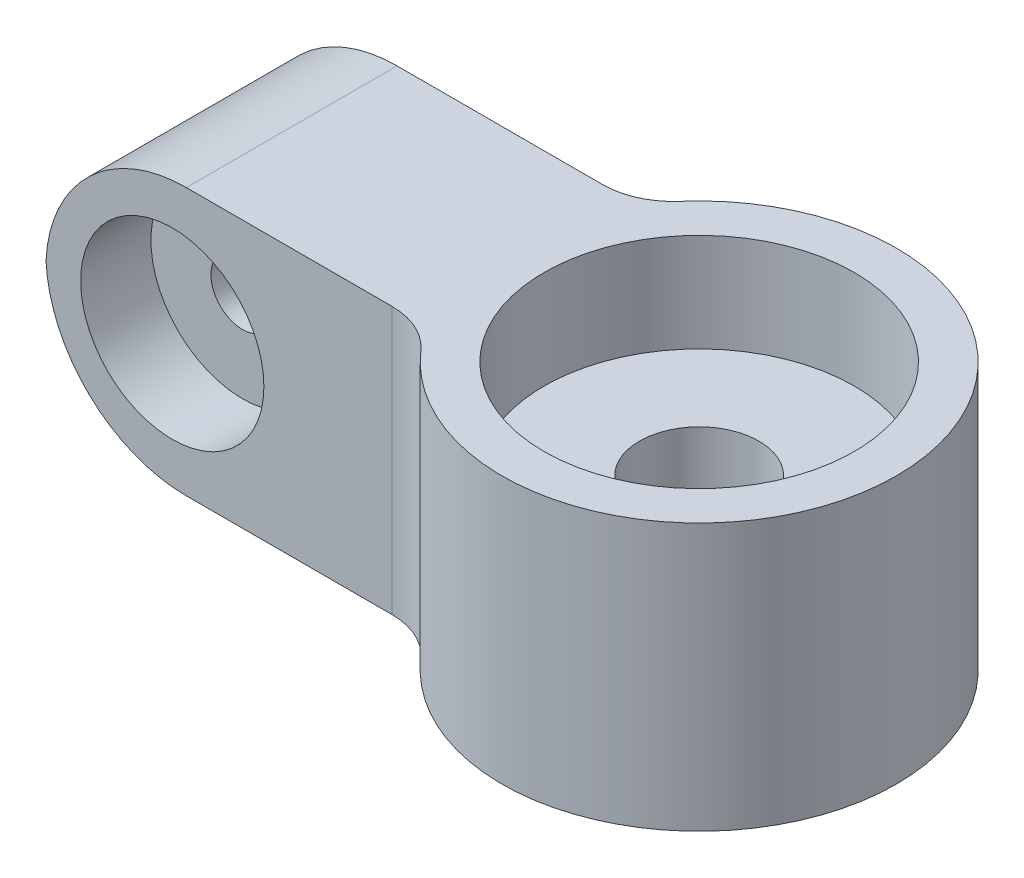
ISO-10303-21;
HEADER;
FILE_DESCRIPTION(('STEP AP214'),'2;1');
FILE_NAME('part.step','',(''),(''),'','','');
FILE_SCHEMA(('AUTOMOTIVE_DESIGN { 1 0 10303 214 1 1 1 1 }'));
ENDSEC;
DATA;
#1=APPLICATION_CONTEXT('core data for automotive mechanical design processes');
#2=APPLICATION_PROTOCOL_DEFINITION('international standard','automotive_design',2000,#1);
#3=PRODUCT_CONTEXT('',#1,'mechanical');
#4=PRODUCT('Part','Part','',(#3));
#5=PRODUCT_RELATED_PRODUCT_CATEGORY('part','',(#4));
#6=PRODUCT_DEFINITION_FORMATION('','',#4);
#7=PRODUCT_DEFINITION_CONTEXT('part definition',#1,'design');
#8=PRODUCT_DEFINITION('design','',#6,#7);
#9=PRODUCT_DEFINITION_SHAPE('','',#8);
#10=(LENGTH_UNIT() NAMED_UNIT(*) SI_UNIT(.MILLI.,.METRE.));
#11=(NAMED_UNIT(*) PLANE_ANGLE_UNIT() SI_UNIT($,.RADIAN.));
#12=(NAMED_UNIT(*) SI_UNIT($,.STERADIAN.) SOLID_ANGLE_UNIT());
#13=UNCERTAINTY_MEASURE_WITH_UNIT(LENGTH_MEASURE(1.E-05),#10,'distance_accuracy_value','');
#14=(GEOMETRIC_REPRESENTATION_CONTEXT(3) GLOBAL_UNCERTAINTY_ASSIGNED_CONTEXT((#13)) GLOBAL_UNIT_ASSIGNED_CONTEXT((#10,
#11,#12)) REPRESENTATION_CONTEXT('',''));
#15=CARTESIAN_POINT('',(0.,0.,0.));
#16=DIRECTION('',(0.,0.,1.));
#17=DIRECTION('',(1.,0.,0.));
#18=AXIS2_PLACEMENT_3D('',#15,#16,#17);
#19=CARTESIAN_POINT('',(39.,-9.5,0.));
#20=DIRECTION('',(0.,1.,0.));
#21=DIRECTION('',(0.,0.,1.));
#22=AXIS2_PLACEMENT_3D('',#19,#20,#21);
#23=CYLINDRICAL_SURFACE('',#22,4.25000000000001);
#24=CARTESIAN_POINT('',(39.,2.5,0.));
#25=DIRECTION('',(0.,1.,0.));
#26=DIRECTION('',(0.,0.,1.));
#27=AXIS2_PLACEMENT_3D('',#24,#25,#26);
#28=CIRCLE('',#27,4.25000000000001);
#29=CARTESIAN_POINT('',(39.,2.5,4.25000000000001));
#30=VERTEX_POINT('',#29);
#31=EDGE_CURVE('E136',#30,#30,#28,.F.);
#32=ORIENTED_EDGE('',*,*,#31,.F.);
#33=EDGE_LOOP('',(#32));
#34=FACE_BOUND('',#33,.T.);
#35=CARTESIAN_POINT('',(39.,-2.5,0.));
#36=DIRECTION('',(0.,1.,0.));
#37=DIRECTION('',(0.,0.,1.));
#38=AXIS2_PLACEMENT_3D('',#35,#36,#37);
#39=CIRCLE('',#38,4.25000000000001);
#40=CARTESIAN_POINT('',(39.,-2.5,4.25000000000001));
#41=VERTEX_POINT('',#40);
#42=EDGE_CURVE('E224',#41,#41,#39,.F.);
#43=ORIENTED_EDGE('',*,*,#42,.T.);
#44=EDGE_LOOP('',(#43));
#45=FACE_BOUND('',#44,.T.);
#46=ADVANCED_FACE('F41',(#34,#45),#23,.F.);
#47=CARTESIAN_POINT('',(9.,0.,7.5));
#48=DIRECTION('',(0.,0.,-1.));
#49=DIRECTION('',(-1.,0.,0.));
#50=AXIS2_PLACEMENT_3D('',#47,#48,#49);
#51=CYLINDRICAL_SURFACE('',#50,2.25);
#52=CARTESIAN_POINT('',(9.,0.,-2.5));
#53=DIRECTION('',(0.,0.,1.));
#54=DIRECTION('',(1.,0.,0.));
#55=AXIS2_PLACEMENT_3D('',#52,#53,#54);
#56=CIRCLE('',#55,2.25);
#57=CARTESIAN_POINT('',(11.25,0.,-2.5));
#58=VERTEX_POINT('',#57);
#59=EDGE_CURVE('E209',#58,#58,#56,.T.);
#60=ORIENTED_EDGE('',*,*,#59,.F.);
#61=EDGE_LOOP('',(#60));
#62=FACE_BOUND('',#61,.T.);
#63=CARTESIAN_POINT('',(9.,0.,2.5));
#64=DIRECTION('',(0.,0.,1.));
#65=DIRECTION('',(1.,0.,0.));
#66=AXIS2_PLACEMENT_3D('',#63,#64,#65);
#67=CIRCLE('',#66,2.25);
#68=CARTESIAN_POINT('',(11.25,0.,2.5));
#69=VERTEX_POINT('',#68);
#70=EDGE_CURVE('E217',#69,#69,#67,.T.);
#71=ORIENTED_EDGE('',*,*,#70,.T.);
#72=EDGE_LOOP('',(#71));
#73=FACE_BOUND('',#72,.T.);
#74=ADVANCED_FACE('F246',(#62,#73),#51,.F.);
#75=CARTESIAN_POINT('',(0.,-9.5,7.5));
#76=DIRECTION('',(0.,1.,0.));
#77=DIRECTION('',(0.,0.,1.));
#78=AXIS2_PLACEMENT_3D('',#75,#76,#77);
#79=PLANE('',#78);
#80=CARTESIAN_POINT('',(39.,-9.5,0.));
#81=DIRECTION('',(0.,1.,0.));
#82=DIRECTION('',(0.,0.,1.));
#83=AXIS2_PLACEMENT_3D('',#80,#81,#82);
#84=CIRCLE('',#83,11.04);
#85=CARTESIAN_POINT('',(39.,-9.5,11.04));
#86=VERTEX_POINT('',#85);
#87=EDGE_CURVE('E193',#86,#86,#84,.T.);
#88=ORIENTED_EDGE('',*,*,#87,.T.);
#89=EDGE_LOOP('',(#88));
#90=FACE_BOUND('',#89,.T.);
#91=DIRECTION('',(1.,0.,0.));
#92=VECTOR('',#91,1.);
#93=CARTESIAN_POINT('',(0.,-9.5,7.5));
#94=LINE('',#93,#92);
#95=CARTESIAN_POINT('',(10.,-9.5,7.5));
#96=VERTEX_POINT('',#95);
#97=CARTESIAN_POINT('',(24.6378413878693,-9.5,7.5));
#98=VERTEX_POINT('',#97);
#99=EDGE_CURVE('E167',#96,#98,#94,.T.);
#100=ORIENTED_EDGE('',*,*,#99,.F.);
#101=DIRECTION('',(0.,0.,-1.));
#102=VECTOR('',#101,1.);
#103=CARTESIAN_POINT('',(10.,-9.5,-7.5));
#104=LINE('',#103,#102);
#105=CARTESIAN_POINT('',(10.,-9.5,-7.5));
#106=VERTEX_POINT('',#105);
#107=EDGE_CURVE('E150',#96,#106,#104,.T.);
#108=ORIENTED_EDGE('',*,*,#107,.T.);
#109=DIRECTION('',(1.,0.,0.));
#110=VECTOR('',#109,1.);
#111=CARTESIAN_POINT('',(0.,-9.5,-7.5));
#112=LINE('',#111,#110);
#113=CARTESIAN_POINT('',(24.6378413878693,-9.5,-7.5));
#114=VERTEX_POINT('',#113);
#115=EDGE_CURVE('E181',#106,#114,#112,.T.);
#116=ORIENTED_EDGE('',*,*,#115,.T.);
#117=CARTESIAN_POINT('',(24.6378413878693,-9.5,-12.5));
#118=DIRECTION('',(0.,1.,0.));
#119=DIRECTION('',(0.,0.,1.));
#120=AXIS2_PLACEMENT_3D('',#117,#118,#119);
#121=CIRCLE('',#120,5.);
#122=CARTESIAN_POINT('',(28.4094166536599,-9.5,-9.21743697478992));
#123=VERTEX_POINT('',#122);
#124=EDGE_CURVE('E112',#114,#123,#121,.T.);
#125=ORIENTED_EDGE('',*,*,#124,.T.);
#126=CARTESIAN_POINT('',(39.,-9.5,0.));
#127=DIRECTION('',(0.,1.,0.));
#128=DIRECTION('',(0.,0.,1.));
#129=AXIS2_PLACEMENT_3D('',#126,#127,#128);
#130=CIRCLE('',#129,14.04);
#131=CARTESIAN_POINT('',(28.4094166536599,-9.5,9.21743697478992));
#132=VERTEX_POINT('',#131);
#133=EDGE_CURVE('E124',#132,#123,#130,.T.);
#134=ORIENTED_EDGE('',*,*,#133,.F.);
#135=CARTESIAN_POINT('',(24.6378413878693,-9.5,12.5));
#136=DIRECTION('',(0.,1.,0.));
#137=DIRECTION('',(0.,0.,1.));
#138=AXIS2_PLACEMENT_3D('',#135,#136,#137);
#139=CIRCLE('',#138,5.);
#140=EDGE_CURVE('E113',#132,#98,#139,.T.);
#141=ORIENTED_EDGE('',*,*,#140,.T.);
#142=EDGE_LOOP('',(#100,#108,#116,#125,#134,#141));
#143=FACE_BOUND('',#142,.T.);
#144=ADVANCED_FACE('F172',(#90,#143),#79,.F.);
#145=CARTESIAN_POINT('',(0.,9.5,7.5));
#146=DIRECTION('',(0.,1.,0.));
#147=DIRECTION('',(0.,0.,1.));
#148=AXIS2_PLACEMENT_3D('',#145,#146,#147);
#149=PLANE('',#148);
#150=CARTESIAN_POINT('',(39.,9.5,0.));
#151=DIRECTION('',(0.,1.,0.));
#152=DIRECTION('',(0.,0.,1.));
#153=AXIS2_PLACEMENT_3D('',#150,#151,#152);
#154=CIRCLE('',#153,11.04);
#155=CARTESIAN_POINT('',(39.,9.5,11.04));
#156=VERTEX_POINT('',#155);
#157=EDGE_CURVE('E184',#156,#156,#154,.T.);
#158=ORIENTED_EDGE('',*,*,#157,.F.);
#159=EDGE_LOOP('',(#158));
#160=FACE_BOUND('',#159,.T.);
#161=DIRECTION('',(1.,0.,0.));
#162=VECTOR('',#161,1.);
#163=CARTESIAN_POINT('',(0.,9.5,-7.5));
#164=LINE('',#163,#162);
#165=CARTESIAN_POINT('',(10.,9.5,-7.5));
#166=VERTEX_POINT('',#165);
#167=CARTESIAN_POINT('',(24.6378413878693,9.5,-7.5));
#168=VERTEX_POINT('',#167);
#169=EDGE_CURVE('E175',#166,#168,#164,.T.);
#170=ORIENTED_EDGE('',*,*,#169,.F.);
#171=DIRECTION('',(0.,0.,-1.));
#172=VECTOR('',#171,1.);
#173=CARTESIAN_POINT('',(10.,9.5,7.5));
#174=LINE('',#173,#172);
#175=CARTESIAN_POINT('',(10.,9.5,7.5));
#176=VERTEX_POINT('',#175);
#177=EDGE_CURVE('E11',#166,#176,#174,.F.);
#178=ORIENTED_EDGE('',*,*,#177,.T.);
#179=DIRECTION('',(1.,0.,0.));
#180=VECTOR('',#179,1.);
#181=CARTESIAN_POINT('',(0.,9.5,7.5));
#182=LINE('',#181,#180);
#183=CARTESIAN_POINT('',(24.6378413878693,9.5,7.5));
#184=VERTEX_POINT('',#183);
#185=EDGE_CURVE('E106',#176,#184,#182,.T.);
#186=ORIENTED_EDGE('',*,*,#185,.T.);
#187=CARTESIAN_POINT('',(24.6378413878693,9.5,12.5));
#188=DIRECTION('',(0.,1.,0.));
#189=DIRECTION('',(0.,0.,1.));
#190=AXIS2_PLACEMENT_3D('',#187,#188,#189);
#191=CIRCLE('',#190,5.);
#192=CARTESIAN_POINT('',(28.4094166536599,9.5,9.21743697478992));
#193=VERTEX_POINT('',#192);
#194=EDGE_CURVE('E100',#184,#193,#191,.F.);
#195=ORIENTED_EDGE('',*,*,#194,.T.);
#196=CARTESIAN_POINT('',(39.,9.5,0.));
#197=DIRECTION('',(0.,1.,0.));
#198=DIRECTION('',(0.,0.,1.));
#199=AXIS2_PLACEMENT_3D('',#196,#197,#198);
#200=CIRCLE('',#199,14.04);
#201=CARTESIAN_POINT('',(28.4094166536599,9.5,-9.21743697478992));
#202=VERTEX_POINT('',#201);
#203=EDGE_CURVE('E104',#193,#202,#200,.T.);
#204=ORIENTED_EDGE('',*,*,#203,.T.);
#205=CARTESIAN_POINT('',(24.6378413878693,9.5,-12.5));
#206=DIRECTION('',(0.,1.,0.));
#207=DIRECTION('',(0.,0.,1.));
#208=AXIS2_PLACEMENT_3D('',#205,#206,#207);
#209=CIRCLE('',#208,5.);
#210=EDGE_CURVE('E147',#202,#168,#209,.F.);
#211=ORIENTED_EDGE('',*,*,#210,.T.);
#212=EDGE_LOOP('',(#170,#178,#186,#195,#204,#211));
#213=FACE_BOUND('',#212,.T.);
#214=ADVANCED_FACE('F102',(#160,#213),#149,.T.);
#215=CARTESIAN_POINT('',(0.,0.,7.5));
#216=DIRECTION('',(0.,0.,1.));
#217=DIRECTION('',(1.,0.,0.));
#218=AXIS2_PLACEMENT_3D('',#215,#216,#217);
#219=PLANE('',#218);
#220=CARTESIAN_POINT('',(10.,-0.5,7.5));
#221=DIRECTION('',(0.,0.,1.));
#222=DIRECTION('',(1.,0.,0.));
#223=AXIS2_PLACEMENT_3D('',#220,#221,#222);
#224=CIRCLE('',#223,10.);
#225=CARTESIAN_POINT('',(0.0125078222809102,0.,7.5));
#226=VERTEX_POINT('',#225);
#227=EDGE_CURVE('E58',#176,#226,#224,.T.);
#228=ORIENTED_EDGE('',*,*,#227,.T.);
#229=CARTESIAN_POINT('',(10.,0.5,7.5));
#230=DIRECTION('',(0.,0.,1.));
#231=DIRECTION('',(1.,0.,0.));
#232=AXIS2_PLACEMENT_3D('',#229,#230,#231);
#233=CIRCLE('',#232,10.);
#234=EDGE_CURVE('E51',#226,#96,#233,.T.);
#235=ORIENTED_EDGE('',*,*,#234,.T.);
#236=ORIENTED_EDGE('',*,*,#99,.T.);
#237=DIRECTION('',(0.,-1.,0.));
#238=VECTOR('',#237,1.);
#239=CARTESIAN_POINT('',(24.6378413878693,9.5,7.5));
#240=LINE('',#239,#238);
#241=EDGE_CURVE('E130',#98,#184,#240,.F.);
#242=ORIENTED_EDGE('',*,*,#241,.T.);
#243=ORIENTED_EDGE('',*,*,#185,.F.);
#244=EDGE_LOOP('',(#228,#235,#236,#242,#243));
#245=FACE_BOUND('',#244,.T.);
#246=CARTESIAN_POINT('',(9.,0.,7.5));
#247=DIRECTION('',(0.,0.,1.));
#248=DIRECTION('',(1.,0.,0.));
#249=AXIS2_PLACEMENT_3D('',#246,#247,#248);
#250=CIRCLE('',#249,6.52);
#251=CARTESIAN_POINT('',(15.52,0.,7.5));
#252=VERTEX_POINT('',#251);
#253=EDGE_CURVE('E218',#252,#252,#250,.T.);
#254=ORIENTED_EDGE('',*,*,#253,.F.);
#255=EDGE_LOOP('',(#254));
#256=FACE_BOUND('',#255,.T.);
#257=ADVANCED_FACE('F165',(#245,#256),#219,.T.);
#258=CARTESIAN_POINT('',(0.,0.,-7.5));
#259=DIRECTION('',(0.,0.,1.));
#260=DIRECTION('',(1.,0.,0.));
#261=AXIS2_PLACEMENT_3D('',#258,#259,#260);
#262=PLANE('',#261);
#263=CARTESIAN_POINT('',(9.,0.,-7.5));
#264=DIRECTION('',(0.,0.,1.));
#265=DIRECTION('',(1.,0.,0.));
#266=AXIS2_PLACEMENT_3D('',#263,#264,#265);
#267=CIRCLE('',#266,6.52);
#268=CARTESIAN_POINT('',(15.52,0.,-7.5));
#269=VERTEX_POINT('',#268);
#270=EDGE_CURVE('E204',#269,#269,#267,.T.);
#271=ORIENTED_EDGE('',*,*,#270,.T.);
#272=EDGE_LOOP('',(#271));
#273=FACE_BOUND('',#272,.T.);
#274=ORIENTED_EDGE('',*,*,#115,.F.);
#275=CARTESIAN_POINT('',(10.,0.5,-7.5));
#276=DIRECTION('',(0.,0.,1.));
#277=DIRECTION('',(1.,0.,0.));
#278=AXIS2_PLACEMENT_3D('',#275,#276,#277);
#279=CIRCLE('',#278,10.);
#280=CARTESIAN_POINT('',(0.0125078222809102,0.,-7.5));
#281=VERTEX_POINT('',#280);
#282=EDGE_CURVE('E157',#106,#281,#279,.F.);
#283=ORIENTED_EDGE('',*,*,#282,.T.);
#284=CARTESIAN_POINT('',(10.,-0.5,-7.5));
#285=DIRECTION('',(0.,0.,1.));
#286=DIRECTION('',(1.,0.,0.));
#287=AXIS2_PLACEMENT_3D('',#284,#285,#286);
#288=CIRCLE('',#287,10.);
#289=EDGE_CURVE('E154',#281,#166,#288,.F.);
#290=ORIENTED_EDGE('',*,*,#289,.T.);
#291=ORIENTED_EDGE('',*,*,#169,.T.);
#292=DIRECTION('',(0.,1.,0.));
#293=VECTOR('',#292,1.);
#294=CARTESIAN_POINT('',(24.6378413878693,0.,-7.5));
#295=LINE('',#294,#293);
#296=EDGE_CURVE('E134',#168,#114,#295,.F.);
#297=ORIENTED_EDGE('',*,*,#296,.T.);
#298=EDGE_LOOP('',(#274,#283,#290,#291,#297));
#299=FACE_BOUND('',#298,.T.);
#300=ADVANCED_FACE('F180',(#273,#299),#262,.F.);
#301=CARTESIAN_POINT('',(9.,0.,2.5));
#302=DIRECTION('',(0.,0.,1.));
#303=DIRECTION('',(1.,0.,0.));
#304=AXIS2_PLACEMENT_3D('',#301,#302,#303);
#305=CYLINDRICAL_SURFACE('',#304,6.52);
#306=CARTESIAN_POINT('',(9.,0.,2.5));
#307=DIRECTION('',(0.,0.,1.));
#308=DIRECTION('',(1.,0.,0.));
#309=AXIS2_PLACEMENT_3D('',#306,#307,#308);
#310=CIRCLE('',#309,6.52);
#311=CARTESIAN_POINT('',(15.52,0.,2.5));
#312=VERTEX_POINT('',#311);
#313=EDGE_CURVE('E213',#312,#312,#310,.T.);
#314=ORIENTED_EDGE('',*,*,#313,.F.);
#315=EDGE_LOOP('',(#314));
#316=FACE_BOUND('',#315,.T.);
#317=ORIENTED_EDGE('',*,*,#253,.T.);
#318=EDGE_LOOP('',(#317));
#319=FACE_BOUND('',#318,.T.);
#320=ADVANCED_FACE('F279',(#316,#319),#305,.F.);
#321=CARTESIAN_POINT('',(9.,0.,2.5));
#322=DIRECTION('',(0.,0.,1.));
#323=DIRECTION('',(1.,0.,0.));
#324=AXIS2_PLACEMENT_3D('',#321,#322,#323);
#325=PLANE('',#324);
#326=ORIENTED_EDGE('',*,*,#70,.F.);
#327=EDGE_LOOP('',(#326));
#328=FACE_BOUND('',#327,.T.);
#329=ORIENTED_EDGE('',*,*,#313,.T.);
#330=EDGE_LOOP('',(#329));
#331=FACE_BOUND('',#330,.T.);
#332=ADVANCED_FACE('F275',(#328,#331),#325,.T.);
#333=CARTESIAN_POINT('',(9.,0.,-2.5));
#334=DIRECTION('',(0.,0.,-1.));
#335=DIRECTION('',(-1.,0.,0.));
#336=AXIS2_PLACEMENT_3D('',#333,#334,#335);
#337=CYLINDRICAL_SURFACE('',#336,6.52);
#338=CARTESIAN_POINT('',(9.,0.,-2.5));
#339=DIRECTION('',(0.,0.,1.));
#340=DIRECTION('',(1.,0.,0.));
#341=AXIS2_PLACEMENT_3D('',#338,#339,#340);
#342=CIRCLE('',#341,6.52);
#343=CARTESIAN_POINT('',(15.52,0.,-2.5));
#344=VERTEX_POINT('',#343);
#345=EDGE_CURVE('E205',#344,#344,#342,.T.);
#346=ORIENTED_EDGE('',*,*,#345,.T.);
#347=EDGE_LOOP('',(#346));
#348=FACE_BOUND('',#347,.T.);
#349=ORIENTED_EDGE('',*,*,#270,.F.);
#350=EDGE_LOOP('',(#349));
#351=FACE_BOUND('',#350,.T.);
#352=ADVANCED_FACE('F271',(#348,#351),#337,.F.);
#353=CARTESIAN_POINT('',(9.,0.,-2.5));
#354=DIRECTION('',(0.,0.,1.));
#355=DIRECTION('',(1.,0.,0.));
#356=AXIS2_PLACEMENT_3D('',#353,#354,#355);
#357=PLANE('',#356);
#358=ORIENTED_EDGE('',*,*,#59,.T.);
#359=EDGE_LOOP('',(#358));
#360=FACE_BOUND('',#359,.T.);
#361=ORIENTED_EDGE('',*,*,#345,.F.);
#362=EDGE_LOOP('',(#361));
#363=FACE_BOUND('',#362,.T.);
#364=ADVANCED_FACE('F262',(#360,#363),#357,.F.);
#365=CARTESIAN_POINT('',(39.,-9.5,0.));
#366=DIRECTION('',(0.,1.,0.));
#367=DIRECTION('',(0.,0.,1.));
#368=AXIS2_PLACEMENT_3D('',#365,#366,#367);
#369=CYLINDRICAL_SURFACE('',#368,14.04);
#370=ORIENTED_EDGE('',*,*,#203,.F.);
#371=DIRECTION('',(0.,1.,0.));
#372=VECTOR('',#371,1.);
#373=CARTESIAN_POINT('',(28.4094166536599,-9.5,9.21743697478992));
#374=LINE('',#373,#372);
#375=EDGE_CURVE('E119',#193,#132,#374,.F.);
#376=ORIENTED_EDGE('',*,*,#375,.T.);
#377=ORIENTED_EDGE('',*,*,#133,.T.);
#378=DIRECTION('',(0.,1.,0.));
#379=VECTOR('',#378,1.);
#380=CARTESIAN_POINT('',(28.4094166536599,-9.5,-9.21743697478992));
#381=LINE('',#380,#379);
#382=EDGE_CURVE('E122',#123,#202,#381,.T.);
#383=ORIENTED_EDGE('',*,*,#382,.T.);
#384=EDGE_LOOP('',(#370,#376,#377,#383));
#385=FACE_BOUND('',#384,.T.);
#386=ADVANCED_FACE('F117',(#385),#369,.T.);
#387=CARTESIAN_POINT('',(39.,-2.5,0.));
#388=DIRECTION('',(0.,1.,0.));
#389=DIRECTION('',(0.,0.,1.));
#390=AXIS2_PLACEMENT_3D('',#387,#388,#389);
#391=PLANE('',#390);
#392=CARTESIAN_POINT('',(39.,-2.5,0.));
#393=DIRECTION('',(0.,1.,0.));
#394=DIRECTION('',(0.,0.,1.));
#395=AXIS2_PLACEMENT_3D('',#392,#393,#394);
#396=CIRCLE('',#395,11.04);
#397=CARTESIAN_POINT('',(39.,-2.5,11.04));
#398=VERTEX_POINT('',#397);
#399=EDGE_CURVE('E125',#398,#398,#396,.T.);
#400=ORIENTED_EDGE('',*,*,#399,.F.);
#401=EDGE_LOOP('',(#400));
#402=FACE_BOUND('',#401,.T.);
#403=ORIENTED_EDGE('',*,*,#42,.F.);
#404=EDGE_LOOP('',(#403));
#405=FACE_BOUND('',#404,.T.);
#406=ADVANCED_FACE('F250',(#402,#405),#391,.F.);
#407=CARTESIAN_POINT('',(39.,-2.5,0.));
#408=DIRECTION('',(0.,-1.,0.));
#409=DIRECTION('',(0.,0.,-1.));
#410=AXIS2_PLACEMENT_3D('',#407,#408,#409);
#411=CYLINDRICAL_SURFACE('',#410,11.04);
#412=ORIENTED_EDGE('',*,*,#399,.T.);
#413=EDGE_LOOP('',(#412));
#414=FACE_BOUND('',#413,.T.);
#415=ORIENTED_EDGE('',*,*,#87,.F.);
#416=EDGE_LOOP('',(#415));
#417=FACE_BOUND('',#416,.T.);
#418=ADVANCED_FACE('F252',(#414,#417),#411,.F.);
#419=CARTESIAN_POINT('',(39.,2.5,0.));
#420=DIRECTION('',(0.,1.,0.));
#421=DIRECTION('',(0.,0.,1.));
#422=AXIS2_PLACEMENT_3D('',#419,#420,#421);
#423=PLANE('',#422);
#424=ORIENTED_EDGE('',*,*,#31,.T.);
#425=EDGE_LOOP('',(#424));
#426=FACE_BOUND('',#425,.T.);
#427=CARTESIAN_POINT('',(39.,2.5,0.));
#428=DIRECTION('',(0.,1.,0.));
#429=DIRECTION('',(0.,0.,1.));
#430=AXIS2_PLACEMENT_3D('',#427,#428,#429);
#431=CIRCLE('',#430,11.04);
#432=CARTESIAN_POINT('',(39.,2.5,11.04));
#433=VERTEX_POINT('',#432);
#434=EDGE_CURVE('E187',#433,#433,#431,.T.);
#435=ORIENTED_EDGE('',*,*,#434,.T.);
#436=EDGE_LOOP('',(#435));
#437=FACE_BOUND('',#436,.T.);
#438=ADVANCED_FACE('F241',(#426,#437),#423,.T.);
#439=CARTESIAN_POINT('',(39.,2.5,0.));
#440=DIRECTION('',(0.,1.,0.));
#441=DIRECTION('',(0.,0.,1.));
#442=AXIS2_PLACEMENT_3D('',#439,#440,#441);
#443=CYLINDRICAL_SURFACE('',#442,11.04);
#444=ORIENTED_EDGE('',*,*,#434,.F.);
#445=EDGE_LOOP('',(#444));
#446=FACE_BOUND('',#445,.T.);
#447=ORIENTED_EDGE('',*,*,#157,.T.);
#448=EDGE_LOOP('',(#447));
#449=FACE_BOUND('',#448,.T.);
#450=ADVANCED_FACE('F266',(#446,#449),#443,.F.);
#451=CARTESIAN_POINT('',(24.6378413878693,-9.5,12.5));
#452=DIRECTION('',(0.,1.,0.));
#453=DIRECTION('',(0.,0.,1.));
#454=AXIS2_PLACEMENT_3D('',#451,#452,#453);
#455=CYLINDRICAL_SURFACE('',#454,5.);
#456=ORIENTED_EDGE('',*,*,#194,.F.);
#457=ORIENTED_EDGE('',*,*,#241,.F.);
#458=ORIENTED_EDGE('',*,*,#140,.F.);
#459=ORIENTED_EDGE('',*,*,#375,.F.);
#460=EDGE_LOOP('',(#456,#457,#458,#459));
#461=FACE_BOUND('',#460,.T.);
#462=ADVANCED_FACE('F127',(#461),#455,.F.);
#463=CARTESIAN_POINT('',(24.6378413878693,-9.5,-12.5));
#464=DIRECTION('',(0.,1.,0.));
#465=DIRECTION('',(0.,0.,1.));
#466=AXIS2_PLACEMENT_3D('',#463,#464,#465);
#467=CYLINDRICAL_SURFACE('',#466,5.);
#468=ORIENTED_EDGE('',*,*,#210,.F.);
#469=ORIENTED_EDGE('',*,*,#382,.F.);
#470=ORIENTED_EDGE('',*,*,#124,.F.);
#471=ORIENTED_EDGE('',*,*,#296,.F.);
#472=EDGE_LOOP('',(#468,#469,#470,#471));
#473=FACE_BOUND('',#472,.T.);
#474=ADVANCED_FACE('F300',(#473),#467,.F.);
#475=CARTESIAN_POINT('',(10.,-0.5,7.5));
#476=DIRECTION('',(0.,0.,-1.));
#477=DIRECTION('',(-1.,0.,0.));
#478=AXIS2_PLACEMENT_3D('',#475,#476,#477);
#479=CYLINDRICAL_SURFACE('',#478,10.);
#480=DIRECTION('',(0.,0.,-1.));
#481=VECTOR('',#480,1.);
#482=CARTESIAN_POINT('',(0.0125078222809102,0.,0.));
#483=LINE('',#482,#481);
#484=EDGE_CURVE('E45',#226,#281,#483,.T.);
#485=ORIENTED_EDGE('',*,*,#484,.F.);
#486=ORIENTED_EDGE('',*,*,#227,.F.);
#487=ORIENTED_EDGE('',*,*,#177,.F.);
#488=ORIENTED_EDGE('',*,*,#289,.F.);
#489=EDGE_LOOP('',(#485,#486,#487,#488));
#490=FACE_BOUND('',#489,.T.);
#491=ADVANCED_FACE('F43',(#490),#479,.T.);
#492=CARTESIAN_POINT('',(10.,0.5,7.5));
#493=DIRECTION('',(0.,0.,1.));
#494=DIRECTION('',(1.,0.,0.));
#495=AXIS2_PLACEMENT_3D('',#492,#493,#494);
#496=CYLINDRICAL_SURFACE('',#495,10.);
#497=ORIENTED_EDGE('',*,*,#234,.F.);
#498=ORIENTED_EDGE('',*,*,#484,.T.);
#499=ORIENTED_EDGE('',*,*,#282,.F.);
#500=ORIENTED_EDGE('',*,*,#107,.F.);
#501=EDGE_LOOP('',(#497,#498,#499,#500));
#502=FACE_BOUND('',#501,.T.);
#503=ADVANCED_FACE('F177',(#502),#496,.T.);
#504=CLOSED_SHELL('',(#46,#74,#144,#214,#257,#300,#320,#332,#352,#364,#386,#406,#418,#438,#450,
#462,#474,#491,#503));
#505=MANIFOLD_SOLID_BREP('B2',#504);
#506=ADVANCED_BREP_SHAPE_REPRESENTATION('',(#18,#505),#14);
#507=SHAPE_DEFINITION_REPRESENTATION(#9,#506);
ENDSEC;
END-ISO-10303-21;
